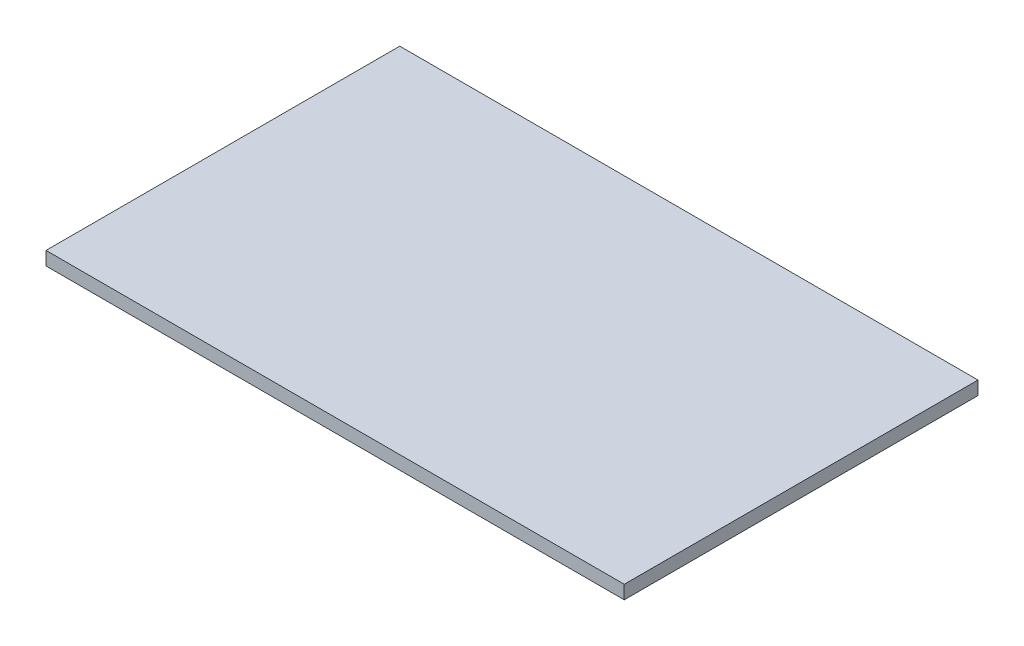
ISO-10303-21;
HEADER;
FILE_DESCRIPTION(('STEP AP214'),'2;1');
FILE_NAME('part.step','',(''),(''),'','','');
FILE_SCHEMA(('AUTOMOTIVE_DESIGN { 1 0 10303 214 1 1 1 1 }'));
ENDSEC;
DATA;
#1=APPLICATION_CONTEXT('core data for automotive mechanical design processes');
#2=APPLICATION_PROTOCOL_DEFINITION('international standard','automotive_design',2000,#1);
#3=PRODUCT_CONTEXT('',#1,'mechanical');
#4=PRODUCT('Part','Part','',(#3));
#5=PRODUCT_RELATED_PRODUCT_CATEGORY('part','',(#4));
#6=PRODUCT_DEFINITION_FORMATION('','',#4);
#7=PRODUCT_DEFINITION_CONTEXT('part definition',#1,'design');
#8=PRODUCT_DEFINITION('design','',#6,#7);
#9=PRODUCT_DEFINITION_SHAPE('','',#8);
#10=(LENGTH_UNIT() NAMED_UNIT(*) SI_UNIT(.MILLI.,.METRE.));
#11=(NAMED_UNIT(*) PLANE_ANGLE_UNIT() SI_UNIT($,.RADIAN.));
#12=(NAMED_UNIT(*) SI_UNIT($,.STERADIAN.) SOLID_ANGLE_UNIT());
#13=UNCERTAINTY_MEASURE_WITH_UNIT(LENGTH_MEASURE(1.E-05),#10,'distance_accuracy_value','');
#14=(GEOMETRIC_REPRESENTATION_CONTEXT(3) GLOBAL_UNCERTAINTY_ASSIGNED_CONTEXT((#13)) GLOBAL_UNIT_ASSIGNED_CONTEXT((#10,
#11,#12)) REPRESENTATION_CONTEXT('',''));
#15=CARTESIAN_POINT('',(0.,0.,0.));
#16=DIRECTION('',(0.,0.,1.));
#17=DIRECTION('',(1.,0.,0.));
#18=AXIS2_PLACEMENT_3D('',#15,#16,#17);
#19=CARTESIAN_POINT('',(0.,1.984375,0.));
#20=DIRECTION('',(1.,0.,0.));
#21=DIRECTION('',(0.,0.,-1.));
#22=AXIS2_PLACEMENT_3D('',#19,#20,#21);
#23=PLANE('',#22);
#24=DIRECTION('',(0.,0.,1.));
#25=VECTOR('',#24,1.);
#26=CARTESIAN_POINT('',(0.,0.,0.));
#27=LINE('',#26,#25);
#28=CARTESIAN_POINT('',(0.,0.,-52.));
#29=VERTEX_POINT('',#28);
#30=CARTESIAN_POINT('',(0.,0.,0.));
#31=VERTEX_POINT('',#30);
#32=EDGE_CURVE('E96',#29,#31,#27,.T.);
#33=ORIENTED_EDGE('',*,*,#32,.T.);
#34=DIRECTION('',(0.,-1.,0.));
#35=VECTOR('',#34,1.);
#36=CARTESIAN_POINT('',(0.,1.984375,0.));
#37=LINE('',#36,#35);
#38=CARTESIAN_POINT('',(0.,1.984375,0.));
#39=VERTEX_POINT('',#38);
#40=EDGE_CURVE('E11',#39,#31,#37,.T.);
#41=ORIENTED_EDGE('',*,*,#40,.F.);
#42=DIRECTION('',(0.,0.,1.));
#43=VECTOR('',#42,1.);
#44=CARTESIAN_POINT('',(0.,1.984375,0.));
#45=LINE('',#44,#43);
#46=CARTESIAN_POINT('',(0.,1.984375,-52.));
#47=VERTEX_POINT('',#46);
#48=EDGE_CURVE('E84',#47,#39,#45,.T.);
#49=ORIENTED_EDGE('',*,*,#48,.F.);
#50=DIRECTION('',(0.,-1.,0.));
#51=VECTOR('',#50,1.);
#52=CARTESIAN_POINT('',(0.,1.984375,-52.));
#53=LINE('',#52,#51);
#54=EDGE_CURVE('E92',#47,#29,#53,.T.);
#55=ORIENTED_EDGE('',*,*,#54,.T.);
#56=EDGE_LOOP('',(#33,#41,#49,#55));
#57=FACE_BOUND('',#56,.T.);
#58=ADVANCED_FACE('F33',(#57),#23,.F.);
#59=CARTESIAN_POINT('',(0.,1.984375,0.));
#60=DIRECTION('',(0.,0.,-1.));
#61=DIRECTION('',(-1.,0.,0.));
#62=AXIS2_PLACEMENT_3D('',#59,#60,#61);
#63=PLANE('',#62);
#64=DIRECTION('',(1.,0.,0.));
#65=VECTOR('',#64,1.);
#66=CARTESIAN_POINT('',(0.,0.,0.));
#67=LINE('',#66,#65);
#68=CARTESIAN_POINT('',(85.,0.,0.));
#69=VERTEX_POINT('',#68);
#70=EDGE_CURVE('E88',#31,#69,#67,.T.);
#71=ORIENTED_EDGE('',*,*,#70,.T.);
#72=DIRECTION('',(0.,-1.,0.));
#73=VECTOR('',#72,1.);
#74=CARTESIAN_POINT('',(85.,1.984375,0.));
#75=LINE('',#74,#73);
#76=CARTESIAN_POINT('',(85.,1.984375,0.));
#77=VERTEX_POINT('',#76);
#78=EDGE_CURVE('E41',#77,#69,#75,.T.);
#79=ORIENTED_EDGE('',*,*,#78,.F.);
#80=DIRECTION('',(1.,0.,0.));
#81=VECTOR('',#80,1.);
#82=CARTESIAN_POINT('',(0.,1.984375,0.));
#83=LINE('',#82,#81);
#84=EDGE_CURVE('E79',#39,#77,#83,.T.);
#85=ORIENTED_EDGE('',*,*,#84,.F.);
#86=ORIENTED_EDGE('',*,*,#40,.T.);
#87=EDGE_LOOP('',(#71,#79,#85,#86));
#88=FACE_BOUND('',#87,.T.);
#89=ADVANCED_FACE('F87',(#88),#63,.F.);
#90=CARTESIAN_POINT('',(85.,1.984375,0.));
#91=DIRECTION('',(-1.,0.,0.));
#92=DIRECTION('',(0.,0.,1.));
#93=AXIS2_PLACEMENT_3D('',#90,#91,#92);
#94=PLANE('',#93);
#95=DIRECTION('',(0.,0.,-1.));
#96=VECTOR('',#95,1.);
#97=CARTESIAN_POINT('',(85.,0.,0.));
#98=LINE('',#97,#96);
#99=CARTESIAN_POINT('',(85.,0.,-52.));
#100=VERTEX_POINT('',#99);
#101=EDGE_CURVE('E66',#69,#100,#98,.T.);
#102=ORIENTED_EDGE('',*,*,#101,.T.);
#103=DIRECTION('',(0.,-1.,0.));
#104=VECTOR('',#103,1.);
#105=CARTESIAN_POINT('',(85.,1.984375,-52.));
#106=LINE('',#105,#104);
#107=CARTESIAN_POINT('',(85.,1.984375,-52.));
#108=VERTEX_POINT('',#107);
#109=EDGE_CURVE('E89',#108,#100,#106,.T.);
#110=ORIENTED_EDGE('',*,*,#109,.F.);
#111=DIRECTION('',(0.,0.,-1.));
#112=VECTOR('',#111,1.);
#113=CARTESIAN_POINT('',(85.,1.984375,0.));
#114=LINE('',#113,#112);
#115=EDGE_CURVE('E82',#77,#108,#114,.T.);
#116=ORIENTED_EDGE('',*,*,#115,.F.);
#117=ORIENTED_EDGE('',*,*,#78,.T.);
#118=EDGE_LOOP('',(#102,#110,#116,#117));
#119=FACE_BOUND('',#118,.T.);
#120=ADVANCED_FACE('F90',(#119),#94,.F.);
#121=CARTESIAN_POINT('',(0.,1.984375,-52.));
#122=DIRECTION('',(0.,0.,1.));
#123=DIRECTION('',(1.,0.,0.));
#124=AXIS2_PLACEMENT_3D('',#121,#122,#123);
#125=PLANE('',#124);
#126=DIRECTION('',(-1.,0.,0.));
#127=VECTOR('',#126,1.);
#128=CARTESIAN_POINT('',(0.,0.,-52.));
#129=LINE('',#128,#127);
#130=EDGE_CURVE('E72',#100,#29,#129,.T.);
#131=ORIENTED_EDGE('',*,*,#130,.T.);
#132=ORIENTED_EDGE('',*,*,#54,.F.);
#133=DIRECTION('',(-1.,0.,0.));
#134=VECTOR('',#133,1.);
#135=CARTESIAN_POINT('',(0.,1.984375,-52.));
#136=LINE('',#135,#134);
#137=EDGE_CURVE('E49',#108,#47,#136,.T.);
#138=ORIENTED_EDGE('',*,*,#137,.F.);
#139=ORIENTED_EDGE('',*,*,#109,.T.);
#140=EDGE_LOOP('',(#131,#132,#138,#139));
#141=FACE_BOUND('',#140,.T.);
#142=ADVANCED_FACE('F103',(#141),#125,.F.);
#143=CARTESIAN_POINT('',(0.,1.984375,0.));
#144=DIRECTION('',(0.,-1.,0.));
#145=DIRECTION('',(0.,0.,-1.));
#146=AXIS2_PLACEMENT_3D('',#143,#144,#145);
#147=PLANE('',#146);
#148=ORIENTED_EDGE('',*,*,#48,.T.);
#149=ORIENTED_EDGE('',*,*,#84,.T.);
#150=ORIENTED_EDGE('',*,*,#115,.T.);
#151=ORIENTED_EDGE('',*,*,#137,.T.);
#152=EDGE_LOOP('',(#148,#149,#150,#151));
#153=FACE_BOUND('',#152,.T.);
#154=ADVANCED_FACE('F80',(#153),#147,.F.);
#155=CARTESIAN_POINT('',(0.,0.,0.));
#156=DIRECTION('',(0.,-1.,0.));
#157=DIRECTION('',(0.,0.,-1.));
#158=AXIS2_PLACEMENT_3D('',#155,#156,#157);
#159=PLANE('',#158);
#160=ORIENTED_EDGE('',*,*,#32,.F.);
#161=ORIENTED_EDGE('',*,*,#130,.F.);
#162=ORIENTED_EDGE('',*,*,#101,.F.);
#163=ORIENTED_EDGE('',*,*,#70,.F.);
#164=EDGE_LOOP('',(#160,#161,#162,#163));
#165=FACE_BOUND('',#164,.T.);
#166=ADVANCED_FACE('F106',(#165),#159,.T.);
#167=CLOSED_SHELL('',(#58,#89,#120,#142,#154,#166));
#168=MANIFOLD_SOLID_BREP('B2',#167);
#169=ADVANCED_BREP_SHAPE_REPRESENTATION('',(#18,#168),#14);
#170=SHAPE_DEFINITION_REPRESENTATION(#9,#169);
ENDSEC;
END-ISO-10303-21;
